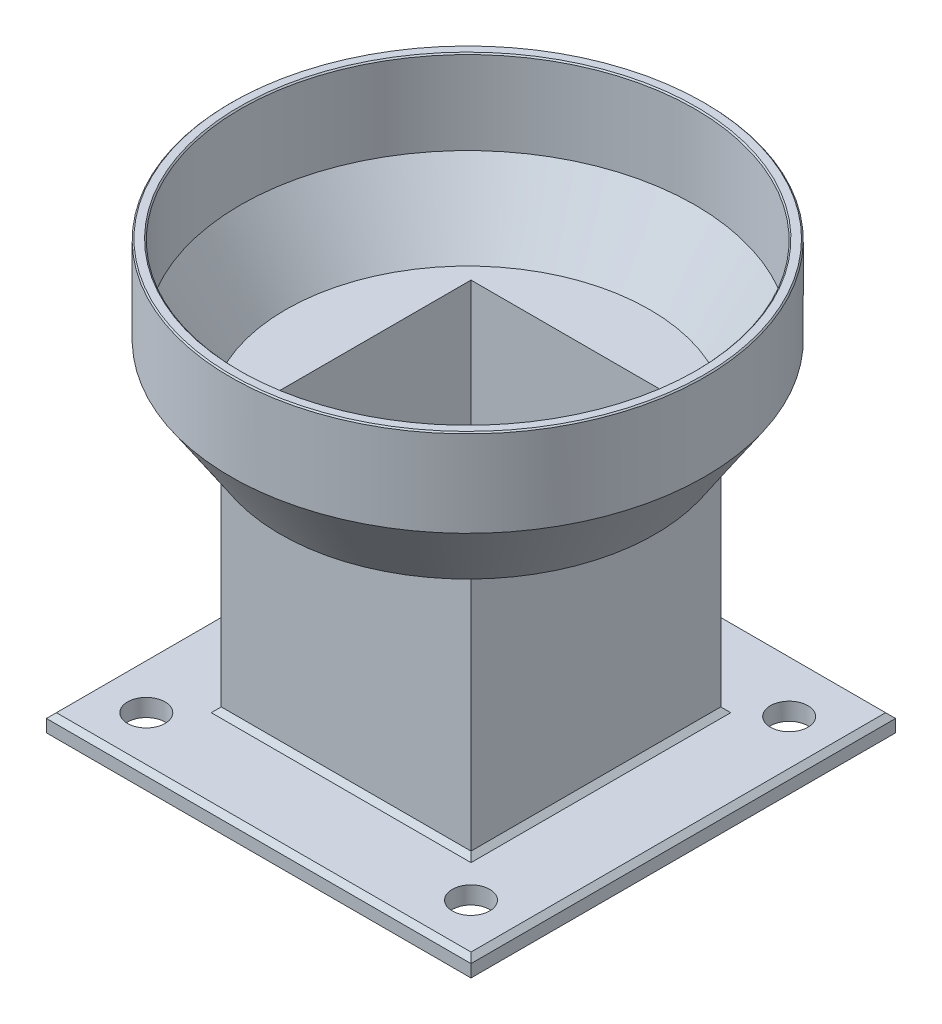
ISO-10303-21;
HEADER;
FILE_DESCRIPTION(('STEP AP214'),'2;1');
FILE_NAME('part.step','',(''),(''),'','','');
FILE_SCHEMA(('AUTOMOTIVE_DESIGN { 1 0 10303 214 1 1 1 1 }'));
ENDSEC;
DATA;
#1=APPLICATION_CONTEXT('core data for automotive mechanical design processes');
#2=APPLICATION_PROTOCOL_DEFINITION('international standard','automotive_design',2000,#1);
#3=PRODUCT_CONTEXT('',#1,'mechanical');
#4=PRODUCT('Part','Part','',(#3));
#5=PRODUCT_RELATED_PRODUCT_CATEGORY('part','',(#4));
#6=PRODUCT_DEFINITION_FORMATION('','',#4);
#7=PRODUCT_DEFINITION_CONTEXT('part definition',#1,'design');
#8=PRODUCT_DEFINITION('design','',#6,#7);
#9=PRODUCT_DEFINITION_SHAPE('','',#8);
#10=(LENGTH_UNIT() NAMED_UNIT(*) SI_UNIT(.MILLI.,.METRE.));
#11=(NAMED_UNIT(*) PLANE_ANGLE_UNIT() SI_UNIT($,.RADIAN.));
#12=(NAMED_UNIT(*) SI_UNIT($,.STERADIAN.) SOLID_ANGLE_UNIT());
#13=UNCERTAINTY_MEASURE_WITH_UNIT(LENGTH_MEASURE(1.E-05),#10,'distance_accuracy_value','');
#14=(GEOMETRIC_REPRESENTATION_CONTEXT(3) GLOBAL_UNCERTAINTY_ASSIGNED_CONTEXT((#13)) GLOBAL_UNIT_ASSIGNED_CONTEXT((#10,
#11,#12)) REPRESENTATION_CONTEXT('',''));
#15=CARTESIAN_POINT('',(0.,0.,0.));
#16=DIRECTION('',(0.,0.,1.));
#17=DIRECTION('',(1.,0.,0.));
#18=AXIS2_PLACEMENT_3D('',#15,#16,#17);
#19=CARTESIAN_POINT('',(-124.850746268657,7.,-26.3059701492537));
#20=DIRECTION('',(1.,0.,0.));
#21=DIRECTION('',(0.,0.,-1.));
#22=AXIS2_PLACEMENT_3D('',#19,#20,#21);
#23=PLANE('',#22);
#24=DIRECTION('',(0.,-1.,0.));
#25=VECTOR('',#24,1.);
#26=CARTESIAN_POINT('',(-124.850746268657,7.,143.694029850746));
#27=LINE('',#26,#25);
#28=CARTESIAN_POINT('',(-124.850746268657,5.,143.694029850746));
#29=VERTEX_POINT('',#28);
#30=CARTESIAN_POINT('',(-124.850746268657,0.,143.694029850746));
#31=VERTEX_POINT('',#30);
#32=EDGE_CURVE('E278',#29,#31,#27,.T.);
#33=ORIENTED_EDGE('',*,*,#32,.F.);
#34=DIRECTION('',(0.,0.,-1.));
#35=VECTOR('',#34,1.);
#36=CARTESIAN_POINT('',(-124.850746268657,5.,-26.3059701492537));
#37=LINE('',#36,#35);
#38=CARTESIAN_POINT('',(-124.850746268657,5.,-26.3059701492537));
#39=VERTEX_POINT('',#38);
#40=EDGE_CURVE('E317',#29,#39,#37,.T.);
#41=ORIENTED_EDGE('',*,*,#40,.T.);
#42=DIRECTION('',(0.,-1.,0.));
#43=VECTOR('',#42,1.);
#44=CARTESIAN_POINT('',(-124.850746268657,7.,-26.3059701492537));
#45=LINE('',#44,#43);
#46=CARTESIAN_POINT('',(-124.850746268657,0.,-26.3059701492537));
#47=VERTEX_POINT('',#46);
#48=EDGE_CURVE('E269',#39,#47,#45,.T.);
#49=ORIENTED_EDGE('',*,*,#48,.T.);
#50=DIRECTION('',(0.,0.,1.));
#51=VECTOR('',#50,1.);
#52=CARTESIAN_POINT('',(-124.850746268657,0.,-26.3059701492537));
#53=LINE('',#52,#51);
#54=EDGE_CURVE('E253',#47,#31,#53,.T.);
#55=ORIENTED_EDGE('',*,*,#54,.T.);
#56=EDGE_LOOP('',(#33,#41,#49,#55));
#57=FACE_BOUND('',#56,.T.);
#58=ADVANCED_FACE('F43',(#57),#23,.F.);
#59=CARTESIAN_POINT('',(-124.850746268657,7.,143.694029850746));
#60=DIRECTION('',(0.,0.,-1.));
#61=DIRECTION('',(-1.,0.,0.));
#62=AXIS2_PLACEMENT_3D('',#59,#60,#61);
#63=PLANE('',#62);
#64=DIRECTION('',(0.,-1.,0.));
#65=VECTOR('',#64,1.);
#66=CARTESIAN_POINT('',(45.1492537313433,7.,143.694029850746));
#67=LINE('',#66,#65);
#68=CARTESIAN_POINT('',(45.1492537313433,5.,143.694029850746));
#69=VERTEX_POINT('',#68);
#70=CARTESIAN_POINT('',(45.1492537313433,0.,143.694029850746));
#71=VERTEX_POINT('',#70);
#72=EDGE_CURVE('E275',#69,#71,#67,.T.);
#73=ORIENTED_EDGE('',*,*,#72,.F.);
#74=DIRECTION('',(-1.,0.,0.));
#75=VECTOR('',#74,1.);
#76=CARTESIAN_POINT('',(-124.850746268657,5.,143.694029850746));
#77=LINE('',#76,#75);
#78=EDGE_CURVE('E314',#69,#29,#77,.T.);
#79=ORIENTED_EDGE('',*,*,#78,.T.);
#80=ORIENTED_EDGE('',*,*,#32,.T.);
#81=DIRECTION('',(1.,0.,0.));
#82=VECTOR('',#81,1.);
#83=CARTESIAN_POINT('',(-124.850746268657,0.,143.694029850746));
#84=LINE('',#83,#82);
#85=EDGE_CURVE('E257',#31,#71,#84,.T.);
#86=ORIENTED_EDGE('',*,*,#85,.T.);
#87=EDGE_LOOP('',(#73,#79,#80,#86));
#88=FACE_BOUND('',#87,.T.);
#89=ADVANCED_FACE('F402',(#88),#63,.F.);
#90=CARTESIAN_POINT('',(45.1492537313433,7.,-26.3059701492537));
#91=DIRECTION('',(-1.,0.,0.));
#92=DIRECTION('',(0.,0.,1.));
#93=AXIS2_PLACEMENT_3D('',#90,#91,#92);
#94=PLANE('',#93);
#95=DIRECTION('',(0.,-1.,0.));
#96=VECTOR('',#95,1.);
#97=CARTESIAN_POINT('',(45.1492537313433,7.,-26.3059701492537));
#98=LINE('',#97,#96);
#99=CARTESIAN_POINT('',(45.1492537313433,5.,-26.3059701492537));
#100=VERTEX_POINT('',#99);
#101=CARTESIAN_POINT('',(45.1492537313433,0.,-26.3059701492537));
#102=VERTEX_POINT('',#101);
#103=EDGE_CURVE('E272',#100,#102,#98,.T.);
#104=ORIENTED_EDGE('',*,*,#103,.F.);
#105=DIRECTION('',(0.,0.,1.));
#106=VECTOR('',#105,1.);
#107=CARTESIAN_POINT('',(45.1492537313433,5.,143.694029850746));
#108=LINE('',#107,#106);
#109=EDGE_CURVE('E311',#100,#69,#108,.T.);
#110=ORIENTED_EDGE('',*,*,#109,.T.);
#111=ORIENTED_EDGE('',*,*,#72,.T.);
#112=DIRECTION('',(0.,0.,-1.));
#113=VECTOR('',#112,1.);
#114=CARTESIAN_POINT('',(45.1492537313433,0.,-26.3059701492537));
#115=LINE('',#114,#113);
#116=EDGE_CURVE('E261',#71,#102,#115,.T.);
#117=ORIENTED_EDGE('',*,*,#116,.T.);
#118=EDGE_LOOP('',(#104,#110,#111,#117));
#119=FACE_BOUND('',#118,.T.);
#120=ADVANCED_FACE('F408',(#119),#94,.F.);
#121=CARTESIAN_POINT('',(-124.850746268657,7.,-26.3059701492537));
#122=DIRECTION('',(0.,0.,1.));
#123=DIRECTION('',(1.,0.,0.));
#124=AXIS2_PLACEMENT_3D('',#121,#122,#123);
#125=PLANE('',#124);
#126=ORIENTED_EDGE('',*,*,#48,.F.);
#127=DIRECTION('',(1.,0.,0.));
#128=VECTOR('',#127,1.);
#129=CARTESIAN_POINT('',(45.1492537313433,5.,-26.3059701492537));
#130=LINE('',#129,#128);
#131=EDGE_CURVE('E307',#39,#100,#130,.T.);
#132=ORIENTED_EDGE('',*,*,#131,.T.);
#133=ORIENTED_EDGE('',*,*,#103,.T.);
#134=DIRECTION('',(-1.,0.,0.));
#135=VECTOR('',#134,1.);
#136=CARTESIAN_POINT('',(-124.850746268657,0.,-26.3059701492537));
#137=LINE('',#136,#135);
#138=EDGE_CURVE('E265',#102,#47,#137,.T.);
#139=ORIENTED_EDGE('',*,*,#138,.T.);
#140=EDGE_LOOP('',(#126,#132,#133,#139));
#141=FACE_BOUND('',#140,.T.);
#142=ADVANCED_FACE('F543',(#141),#125,.F.);
#143=CARTESIAN_POINT('',(0.,7.,0.));
#144=DIRECTION('',(0.,1.,0.));
#145=DIRECTION('',(0.,0.,1.));
#146=AXIS2_PLACEMENT_3D('',#143,#144,#145);
#147=PLANE('',#146);
#148=CARTESIAN_POINT('',(25.1492537313433,7.,-3.69402985074634));
#149=DIRECTION('',(0.,1.,0.));
#150=DIRECTION('',(0.,0.,-1.));
#151=AXIS2_PLACEMENT_3D('',#148,#149,#150);
#152=CIRCLE('',#151,7.49999999999999);
#153=CARTESIAN_POINT('',(25.1492537313433,7.,-11.1940298507463));
#154=VERTEX_POINT('',#153);
#155=EDGE_CURVE('E812',#154,#154,#152,.T.);
#156=ORIENTED_EDGE('',*,*,#155,.F.);
#157=EDGE_LOOP('',(#156));
#158=FACE_BOUND('',#157,.T.);
#159=CARTESIAN_POINT('',(-104.850746268657,7.,123.694029850746));
#160=DIRECTION('',(0.,1.,0.));
#161=DIRECTION('',(0.,0.,1.));
#162=AXIS2_PLACEMENT_3D('',#159,#160,#161);
#163=CIRCLE('',#162,7.50000000000003);
#164=CARTESIAN_POINT('',(-104.850746268657,7.,131.194029850746));
#165=VERTEX_POINT('',#164);
#166=EDGE_CURVE('E808',#165,#165,#163,.T.);
#167=ORIENTED_EDGE('',*,*,#166,.F.);
#168=EDGE_LOOP('',(#167));
#169=FACE_BOUND('',#168,.T.);
#170=CARTESIAN_POINT('',(-104.850746268657,7.,-3.69402985074634));
#171=DIRECTION('',(0.,1.,0.));
#172=DIRECTION('',(0.,0.,-1.));
#173=AXIS2_PLACEMENT_3D('',#170,#171,#172);
#174=CIRCLE('',#173,7.50000000000003);
#175=CARTESIAN_POINT('',(-104.850746268657,7.,-11.1940298507464));
#176=VERTEX_POINT('',#175);
#177=EDGE_CURVE('E800',#176,#176,#174,.T.);
#178=ORIENTED_EDGE('',*,*,#177,.F.);
#179=EDGE_LOOP('',(#178));
#180=FACE_BOUND('',#179,.T.);
#181=CARTESIAN_POINT('',(25.1492537313433,7.,123.694029850746));
#182=DIRECTION('',(0.,1.,0.));
#183=DIRECTION('',(0.,0.,1.));
#184=AXIS2_PLACEMENT_3D('',#181,#182,#183);
#185=CIRCLE('',#184,7.49999999999999);
#186=CARTESIAN_POINT('',(25.1492537313433,7.,131.194029850746));
#187=VERTEX_POINT('',#186);
#188=EDGE_CURVE('E374',#187,#187,#185,.T.);
#189=ORIENTED_EDGE('',*,*,#188,.F.);
#190=EDGE_LOOP('',(#189));
#191=FACE_BOUND('',#190,.T.);
#192=DIRECTION('',(0.,0.,-1.));
#193=VECTOR('',#192,1.);
#194=CARTESIAN_POINT('',(43.1492537313433,7.,-26.3059701492537));
#195=LINE('',#194,#193);
#196=CARTESIAN_POINT('',(43.1492537313433,7.,141.694029850746));
#197=VERTEX_POINT('',#196);
#198=CARTESIAN_POINT('',(43.1492537313433,7.,-24.3059701492537));
#199=VERTEX_POINT('',#198);
#200=EDGE_CURVE('E300',#197,#199,#195,.T.);
#201=ORIENTED_EDGE('',*,*,#200,.T.);
#202=DIRECTION('',(-1.,0.,0.));
#203=VECTOR('',#202,1.);
#204=CARTESIAN_POINT('',(-124.850746268657,7.,-24.3059701492537));
#205=LINE('',#204,#203);
#206=CARTESIAN_POINT('',(-122.850746268657,7.,-24.3059701492537));
#207=VERTEX_POINT('',#206);
#208=EDGE_CURVE('E303',#199,#207,#205,.T.);
#209=ORIENTED_EDGE('',*,*,#208,.T.);
#210=DIRECTION('',(0.,0.,1.));
#211=VECTOR('',#210,1.);
#212=CARTESIAN_POINT('',(-122.850746268657,7.,143.694029850746));
#213=LINE('',#212,#211);
#214=CARTESIAN_POINT('',(-122.850746268657,7.,141.694029850746));
#215=VERTEX_POINT('',#214);
#216=EDGE_CURVE('E294',#207,#215,#213,.T.);
#217=ORIENTED_EDGE('',*,*,#216,.T.);
#218=DIRECTION('',(1.,0.,0.));
#219=VECTOR('',#218,1.);
#220=CARTESIAN_POINT('',(45.1492537313433,7.,141.694029850746));
#221=LINE('',#220,#219);
#222=EDGE_CURVE('E297',#215,#197,#221,.T.);
#223=ORIENTED_EDGE('',*,*,#222,.T.);
#224=EDGE_LOOP('',(#201,#209,#217,#223));
#225=FACE_BOUND('',#224,.T.);
#226=DIRECTION('',(0.,0.,1.));
#227=VECTOR('',#226,1.);
#228=CARTESIAN_POINT('',(12.1492537313433,7.,0.));
#229=LINE('',#228,#227);
#230=CARTESIAN_POINT('',(12.1492537313433,7.,6.69402985074626));
#231=VERTEX_POINT('',#230);
#232=CARTESIAN_POINT('',(12.1492537313433,7.,110.694029850746));
#233=VERTEX_POINT('',#232);
#234=EDGE_CURVE('E287',#231,#233,#229,.T.);
#235=ORIENTED_EDGE('',*,*,#234,.T.);
#236=DIRECTION('',(-1.,0.,0.));
#237=VECTOR('',#236,1.);
#238=CARTESIAN_POINT('',(0.,7.,110.694029850746));
#239=LINE('',#238,#237);
#240=CARTESIAN_POINT('',(-91.8507462686567,7.,110.694029850746));
#241=VERTEX_POINT('',#240);
#242=EDGE_CURVE('E290',#233,#241,#239,.T.);
#243=ORIENTED_EDGE('',*,*,#242,.T.);
#244=DIRECTION('',(0.,0.,-1.));
#245=VECTOR('',#244,1.);
#246=CARTESIAN_POINT('',(-91.8507462686567,7.,0.));
#247=LINE('',#246,#245);
#248=CARTESIAN_POINT('',(-91.8507462686567,7.,6.69402985074626));
#249=VERTEX_POINT('',#248);
#250=EDGE_CURVE('E281',#241,#249,#247,.T.);
#251=ORIENTED_EDGE('',*,*,#250,.T.);
#252=DIRECTION('',(1.,0.,0.));
#253=VECTOR('',#252,1.);
#254=CARTESIAN_POINT('',(0.,7.,6.69402985074626));
#255=LINE('',#254,#253);
#256=EDGE_CURVE('E284',#249,#231,#255,.T.);
#257=ORIENTED_EDGE('',*,*,#256,.T.);
#258=EDGE_LOOP('',(#235,#243,#251,#257));
#259=FACE_BOUND('',#258,.T.);
#260=ADVANCED_FACE('F540',(#158,#169,#180,#191,#225,#259),#147,.T.);
#261=CARTESIAN_POINT('',(0.,0.,0.));
#262=DIRECTION('',(0.,1.,0.));
#263=DIRECTION('',(0.,0.,1.));
#264=AXIS2_PLACEMENT_3D('',#261,#262,#263);
#265=PLANE('',#264);
#266=CARTESIAN_POINT('',(25.1492537313433,0.,-3.69402985074634));
#267=DIRECTION('',(0.,1.,0.));
#268=DIRECTION('',(0.,0.,1.));
#269=AXIS2_PLACEMENT_3D('',#266,#267,#268);
#270=CIRCLE('',#269,7.49999999999999);
#271=CARTESIAN_POINT('',(25.1492537313433,0.,3.80597014925366));
#272=VERTEX_POINT('',#271);
#273=EDGE_CURVE('E48',#272,#272,#270,.T.);
#274=ORIENTED_EDGE('',*,*,#273,.T.);
#275=EDGE_LOOP('',(#274));
#276=FACE_BOUND('',#275,.T.);
#277=CARTESIAN_POINT('',(-104.850746268657,0.,123.694029850746));
#278=DIRECTION('',(0.,1.,0.));
#279=DIRECTION('',(0.,0.,1.));
#280=AXIS2_PLACEMENT_3D('',#277,#278,#279);
#281=CIRCLE('',#280,7.50000000000003);
#282=CARTESIAN_POINT('',(-104.850746268657,0.,131.194029850746));
#283=VERTEX_POINT('',#282);
#284=EDGE_CURVE('E377',#283,#283,#281,.T.);
#285=ORIENTED_EDGE('',*,*,#284,.T.);
#286=EDGE_LOOP('',(#285));
#287=FACE_BOUND('',#286,.T.);
#288=CARTESIAN_POINT('',(-104.850746268657,0.,-3.69402985074634));
#289=DIRECTION('',(0.,1.,0.));
#290=DIRECTION('',(0.,0.,1.));
#291=AXIS2_PLACEMENT_3D('',#288,#289,#290);
#292=CIRCLE('',#291,7.50000000000003);
#293=CARTESIAN_POINT('',(-104.850746268657,0.,3.80597014925369));
#294=VERTEX_POINT('',#293);
#295=EDGE_CURVE('E373',#294,#294,#292,.T.);
#296=ORIENTED_EDGE('',*,*,#295,.T.);
#297=EDGE_LOOP('',(#296));
#298=FACE_BOUND('',#297,.T.);
#299=CARTESIAN_POINT('',(25.1492537313433,0.,123.694029850746));
#300=DIRECTION('',(0.,1.,0.));
#301=DIRECTION('',(0.,0.,1.));
#302=AXIS2_PLACEMENT_3D('',#299,#300,#301);
#303=CIRCLE('',#302,7.49999999999999);
#304=CARTESIAN_POINT('',(25.1492537313433,0.,131.194029850746));
#305=VERTEX_POINT('',#304);
#306=EDGE_CURVE('E369',#305,#305,#303,.T.);
#307=ORIENTED_EDGE('',*,*,#306,.T.);
#308=EDGE_LOOP('',(#307));
#309=FACE_BOUND('',#308,.T.);
#310=ORIENTED_EDGE('',*,*,#54,.F.);
#311=ORIENTED_EDGE('',*,*,#138,.F.);
#312=ORIENTED_EDGE('',*,*,#116,.F.);
#313=ORIENTED_EDGE('',*,*,#85,.F.);
#314=EDGE_LOOP('',(#310,#311,#312,#313));
#315=FACE_BOUND('',#314,.T.);
#316=ADVANCED_FACE('F386',(#276,#287,#298,#309,#315),#265,.F.);
#317=CARTESIAN_POINT('',(-89.8507462686567,107.,8.69402985074628));
#318=DIRECTION('',(1.,0.,0.));
#319=DIRECTION('',(0.,0.,-1.));
#320=AXIS2_PLACEMENT_3D('',#317,#318,#319);
#321=PLANE('',#320);
#322=DIRECTION('',(0.,-1.,0.));
#323=VECTOR('',#322,1.);
#324=CARTESIAN_POINT('',(-89.8507462686567,107.,8.69402985074628));
#325=LINE('',#324,#323);
#326=CARTESIAN_POINT('',(-89.8507462686567,107.,8.69402985074628));
#327=VERTEX_POINT('',#326);
#328=CARTESIAN_POINT('',(-89.8507462686567,9.00000000000008,8.69402985074628));
#329=VERTEX_POINT('',#328);
#330=EDGE_CURVE('E240',#327,#329,#325,.T.);
#331=ORIENTED_EDGE('',*,*,#330,.T.);
#332=DIRECTION('',(0.,0.,1.));
#333=VECTOR('',#332,1.);
#334=CARTESIAN_POINT('',(-89.8507462686567,9.00000000000005,8.69402985074628));
#335=LINE('',#334,#333);
#336=CARTESIAN_POINT('',(-89.8507462686567,9.00000000000008,108.694029850746));
#337=VERTEX_POINT('',#336);
#338=EDGE_CURVE('E328',#329,#337,#335,.T.);
#339=ORIENTED_EDGE('',*,*,#338,.T.);
#340=DIRECTION('',(0.,-1.,0.));
#341=VECTOR('',#340,1.);
#342=CARTESIAN_POINT('',(-89.8507462686567,107.,108.694029850746));
#343=LINE('',#342,#341);
#344=CARTESIAN_POINT('',(-89.8507462686567,107.,108.694029850746));
#345=VERTEX_POINT('',#344);
#346=EDGE_CURVE('E249',#345,#337,#343,.T.);
#347=ORIENTED_EDGE('',*,*,#346,.F.);
#348=DIRECTION('',(0.,0.,1.));
#349=VECTOR('',#348,1.);
#350=CARTESIAN_POINT('',(-89.8507462686567,107.,8.69402985074628));
#351=LINE('',#350,#349);
#352=EDGE_CURVE('E224',#327,#345,#351,.T.);
#353=ORIENTED_EDGE('',*,*,#352,.F.);
#354=EDGE_LOOP('',(#331,#339,#347,#353));
#355=FACE_BOUND('',#354,.T.);
#356=ADVANCED_FACE('F535',(#355),#321,.F.);
#357=CARTESIAN_POINT('',(-89.8507462686567,107.,108.694029850746));
#358=DIRECTION('',(0.,0.,-1.));
#359=DIRECTION('',(-1.,0.,0.));
#360=AXIS2_PLACEMENT_3D('',#357,#358,#359);
#361=PLANE('',#360);
#362=ORIENTED_EDGE('',*,*,#346,.T.);
#363=DIRECTION('',(1.,0.,0.));
#364=VECTOR('',#363,1.);
#365=CARTESIAN_POINT('',(-89.8507462686567,9.00000000000005,108.694029850746));
#366=LINE('',#365,#364);
#367=CARTESIAN_POINT('',(10.1492537313433,9.00000000000008,108.694029850746));
#368=VERTEX_POINT('',#367);
#369=EDGE_CURVE('E320',#337,#368,#366,.T.);
#370=ORIENTED_EDGE('',*,*,#369,.T.);
#371=DIRECTION('',(0.,-1.,0.));
#372=VECTOR('',#371,1.);
#373=CARTESIAN_POINT('',(10.1492537313433,107.,108.694029850746));
#374=LINE('',#373,#372);
#375=CARTESIAN_POINT('',(10.1492537313433,107.,108.694029850746));
#376=VERTEX_POINT('',#375);
#377=EDGE_CURVE('E246',#376,#368,#374,.T.);
#378=ORIENTED_EDGE('',*,*,#377,.F.);
#379=DIRECTION('',(1.,0.,0.));
#380=VECTOR('',#379,1.);
#381=CARTESIAN_POINT('',(-89.8507462686567,107.,108.694029850746));
#382=LINE('',#381,#380);
#383=EDGE_CURVE('E228',#345,#376,#382,.T.);
#384=ORIENTED_EDGE('',*,*,#383,.F.);
#385=EDGE_LOOP('',(#362,#370,#378,#384));
#386=FACE_BOUND('',#385,.T.);
#387=ADVANCED_FACE('F532',(#386),#361,.F.);
#388=CARTESIAN_POINT('',(10.1492537313433,107.,8.69402985074628));
#389=DIRECTION('',(-1.,0.,0.));
#390=DIRECTION('',(0.,0.,1.));
#391=AXIS2_PLACEMENT_3D('',#388,#389,#390);
#392=PLANE('',#391);
#393=ORIENTED_EDGE('',*,*,#377,.T.);
#394=DIRECTION('',(0.,0.,-1.));
#395=VECTOR('',#394,1.);
#396=CARTESIAN_POINT('',(10.1492537313433,9.00000000000005,8.69402985074628));
#397=LINE('',#396,#395);
#398=CARTESIAN_POINT('',(10.1492537313433,9.00000000000008,8.69402985074628));
#399=VERTEX_POINT('',#398);
#400=EDGE_CURVE('E70',#368,#399,#397,.T.);
#401=ORIENTED_EDGE('',*,*,#400,.T.);
#402=DIRECTION('',(0.,-1.,0.));
#403=VECTOR('',#402,1.);
#404=CARTESIAN_POINT('',(10.1492537313433,107.,8.69402985074628));
#405=LINE('',#404,#403);
#406=CARTESIAN_POINT('',(10.1492537313433,107.,8.69402985074628));
#407=VERTEX_POINT('',#406);
#408=EDGE_CURVE('E243',#407,#399,#405,.T.);
#409=ORIENTED_EDGE('',*,*,#408,.F.);
#410=DIRECTION('',(0.,0.,-1.));
#411=VECTOR('',#410,1.);
#412=CARTESIAN_POINT('',(10.1492537313433,107.,8.69402985074628));
#413=LINE('',#412,#411);
#414=EDGE_CURVE('E232',#376,#407,#413,.T.);
#415=ORIENTED_EDGE('',*,*,#414,.F.);
#416=EDGE_LOOP('',(#393,#401,#409,#415));
#417=FACE_BOUND('',#416,.T.);
#418=ADVANCED_FACE('F529',(#417),#392,.F.);
#419=CARTESIAN_POINT('',(-89.8507462686567,107.,8.69402985074628));
#420=DIRECTION('',(0.,0.,1.));
#421=DIRECTION('',(1.,0.,0.));
#422=AXIS2_PLACEMENT_3D('',#419,#420,#421);
#423=PLANE('',#422);
#424=ORIENTED_EDGE('',*,*,#408,.T.);
#425=DIRECTION('',(-1.,0.,0.));
#426=VECTOR('',#425,1.);
#427=CARTESIAN_POINT('',(-89.8507462686567,9.00000000000005,8.69402985074628));
#428=LINE('',#427,#426);
#429=EDGE_CURVE('E62',#399,#329,#428,.T.);
#430=ORIENTED_EDGE('',*,*,#429,.T.);
#431=ORIENTED_EDGE('',*,*,#330,.F.);
#432=DIRECTION('',(-1.,0.,0.));
#433=VECTOR('',#432,1.);
#434=CARTESIAN_POINT('',(-89.8507462686567,107.,8.69402985074628));
#435=LINE('',#434,#433);
#436=EDGE_CURVE('E236',#407,#327,#435,.T.);
#437=ORIENTED_EDGE('',*,*,#436,.F.);
#438=EDGE_LOOP('',(#424,#430,#431,#437));
#439=FACE_BOUND('',#438,.T.);
#440=ADVANCED_FACE('F518',(#439),#423,.F.);
#441=CARTESIAN_POINT('',(-39.8507462686567,107.,60.));
#442=DIRECTION('',(0.,1.,0.));
#443=DIRECTION('',(-1.,0.,0.));
#444=AXIS2_PLACEMENT_3D('',#441,#442,#443);
#445=PLANE('',#444);
#446=CARTESIAN_POINT('',(-39.8507462686567,107.,60.));
#447=DIRECTION('',(0.,1.,0.));
#448=DIRECTION('',(-1.,0.,0.));
#449=AXIS2_PLACEMENT_3D('',#446,#447,#448);
#450=CIRCLE('',#449,75.);
#451=CARTESIAN_POINT('',(-114.850746268657,107.,60.));
#452=VERTEX_POINT('',#451);
#453=EDGE_CURVE('E216',#452,#452,#450,.T.);
#454=ORIENTED_EDGE('',*,*,#453,.F.);
#455=EDGE_LOOP('',(#454));
#456=FACE_BOUND('',#455,.T.);
#457=ORIENTED_EDGE('',*,*,#436,.T.);
#458=ORIENTED_EDGE('',*,*,#352,.T.);
#459=ORIENTED_EDGE('',*,*,#383,.T.);
#460=ORIENTED_EDGE('',*,*,#414,.T.);
#461=EDGE_LOOP('',(#457,#458,#459,#460));
#462=FACE_BOUND('',#461,.T.);
#463=ADVANCED_FACE('F515',(#456,#462),#445,.F.);
#464=CARTESIAN_POINT('',(-39.8507462686567,107.,60.));
#465=DIRECTION('',(0.,1.,0.));
#466=DIRECTION('',(-1.,0.,0.));
#467=AXIS2_PLACEMENT_3D('',#464,#465,#466);
#468=CONICAL_SURFACE('',#467,75.,0.588002603547568);
#469=CARTESIAN_POINT('',(-39.8507462686567,137.,60.));
#470=DIRECTION('',(0.,1.,0.));
#471=DIRECTION('',(-1.,0.,0.));
#472=AXIS2_PLACEMENT_3D('',#469,#470,#471);
#473=CIRCLE('',#472,95.);
#474=CARTESIAN_POINT('',(-134.850746268657,137.,60.));
#475=VERTEX_POINT('',#474);
#476=EDGE_CURVE('E220',#475,#475,#473,.T.);
#477=ORIENTED_EDGE('',*,*,#476,.F.);
#478=EDGE_LOOP('',(#477));
#479=FACE_BOUND('',#478,.T.);
#480=ORIENTED_EDGE('',*,*,#453,.T.);
#481=EDGE_LOOP('',(#480));
#482=FACE_BOUND('',#481,.T.);
#483=ADVANCED_FACE('F517',(#479,#482),#468,.T.);
#484=CARTESIAN_POINT('',(-39.8507462686567,172.,60.));
#485=DIRECTION('',(0.,1.,0.));
#486=DIRECTION('',(-1.,0.,0.));
#487=AXIS2_PLACEMENT_3D('',#484,#485,#486);
#488=CYLINDRICAL_SURFACE('',#487,95.);
#489=CARTESIAN_POINT('',(-39.8507462686567,171.5,60.));
#490=DIRECTION('',(0.,-1.,0.));
#491=DIRECTION('',(0.,0.,-1.));
#492=AXIS2_PLACEMENT_3D('',#489,#490,#491);
#493=CIRCLE('',#492,95.);
#494=CARTESIAN_POINT('',(-39.8507462686567,171.5,-35.));
#495=VERTEX_POINT('',#494);
#496=EDGE_CURVE('E54',#495,#495,#493,.T.);
#497=ORIENTED_EDGE('',*,*,#496,.T.);
#498=EDGE_LOOP('',(#497));
#499=FACE_BOUND('',#498,.T.);
#500=ORIENTED_EDGE('',*,*,#476,.T.);
#501=EDGE_LOOP('',(#500));
#502=FACE_BOUND('',#501,.T.);
#503=ADVANCED_FACE('F489',(#499,#502),#488,.T.);
#504=CARTESIAN_POINT('',(55.1492537313433,172.,60.));
#505=DIRECTION('',(0.,-1.,0.));
#506=DIRECTION('',(1.,0.,0.));
#507=AXIS2_PLACEMENT_3D('',#504,#505,#506);
#508=PLANE('',#507);
#509=CARTESIAN_POINT('',(-39.8507462686567,172.,60.));
#510=DIRECTION('',(0.,-1.,0.));
#511=DIRECTION('',(1.,0.,0.));
#512=AXIS2_PLACEMENT_3D('',#509,#510,#511);
#513=CIRCLE('',#512,94.5);
#514=CARTESIAN_POINT('',(54.6492537313433,172.,60.));
#515=VERTEX_POINT('',#514);
#516=EDGE_CURVE('E362',#515,#515,#513,.F.);
#517=ORIENTED_EDGE('',*,*,#516,.T.);
#518=EDGE_LOOP('',(#517));
#519=FACE_BOUND('',#518,.T.);
#520=CARTESIAN_POINT('',(-39.8507462686567,172.,60.));
#521=DIRECTION('',(0.,-1.,0.));
#522=DIRECTION('',(1.,0.,0.));
#523=AXIS2_PLACEMENT_3D('',#520,#521,#522);
#524=CIRCLE('',#523,91.4999999999999);
#525=CARTESIAN_POINT('',(51.6492537313432,172.,60.));
#526=VERTEX_POINT('',#525);
#527=EDGE_CURVE('E331',#526,#526,#524,.T.);
#528=ORIENTED_EDGE('',*,*,#527,.T.);
#529=EDGE_LOOP('',(#528));
#530=FACE_BOUND('',#529,.T.);
#531=ADVANCED_FACE('F485',(#519,#530),#508,.F.);
#532=CARTESIAN_POINT('',(0.,4.,0.));
#533=DIRECTION('',(0.,1.,0.));
#534=DIRECTION('',(0.,0.,1.));
#535=AXIS2_PLACEMENT_3D('',#532,#533,#534);
#536=PLANE('',#535);
#537=DIRECTION('',(0.,0.,1.));
#538=VECTOR('',#537,1.);
#539=CARTESIAN_POINT('',(6.14925373134329,4.,0.));
#540=LINE('',#539,#538);
#541=CARTESIAN_POINT('',(6.14925373134329,4.,12.6940298507463));
#542=VERTEX_POINT('',#541);
#543=CARTESIAN_POINT('',(6.1492537313433,4.,104.694029850746));
#544=VERTEX_POINT('',#543);
#545=EDGE_CURVE('E209',#542,#544,#540,.T.);
#546=ORIENTED_EDGE('',*,*,#545,.F.);
#547=DIRECTION('',(1.,0.,0.));
#548=VECTOR('',#547,1.);
#549=CARTESIAN_POINT('',(0.,4.,12.6940298507463));
#550=LINE('',#549,#548);
#551=CARTESIAN_POINT('',(-85.8507462686567,4.,12.6940298507463));
#552=VERTEX_POINT('',#551);
#553=EDGE_CURVE('E205',#552,#542,#550,.T.);
#554=ORIENTED_EDGE('',*,*,#553,.F.);
#555=DIRECTION('',(0.,0.,-1.));
#556=VECTOR('',#555,1.);
#557=CARTESIAN_POINT('',(-85.8507462686567,4.,0.));
#558=LINE('',#557,#556);
#559=CARTESIAN_POINT('',(-85.8507462686567,4.,104.694029850746));
#560=VERTEX_POINT('',#559);
#561=EDGE_CURVE('E180',#560,#552,#558,.T.);
#562=ORIENTED_EDGE('',*,*,#561,.F.);
#563=DIRECTION('',(-1.,0.,0.));
#564=VECTOR('',#563,1.);
#565=CARTESIAN_POINT('',(0.,4.,104.694029850746));
#566=LINE('',#565,#564);
#567=EDGE_CURVE('E212',#544,#560,#566,.T.);
#568=ORIENTED_EDGE('',*,*,#567,.F.);
#569=EDGE_LOOP('',(#546,#554,#562,#568));
#570=FACE_BOUND('',#569,.T.);
#571=ADVANCED_FACE('F488',(#570),#536,.T.);
#572=CARTESIAN_POINT('',(-85.8507462686567,107.,8.69402985074628));
#573=DIRECTION('',(1.,0.,0.));
#574=DIRECTION('',(0.,0.,-1.));
#575=AXIS2_PLACEMENT_3D('',#572,#573,#574);
#576=PLANE('',#575);
#577=ORIENTED_EDGE('',*,*,#561,.T.);
#578=DIRECTION('',(0.,-1.,0.));
#579=VECTOR('',#578,1.);
#580=CARTESIAN_POINT('',(-85.8507462686567,107.,12.6940298507463));
#581=LINE('',#580,#579);
#582=CARTESIAN_POINT('',(-85.8507462686567,111.,12.6940298507463));
#583=VERTEX_POINT('',#582);
#584=EDGE_CURVE('E178',#583,#552,#581,.T.);
#585=ORIENTED_EDGE('',*,*,#584,.F.);
#586=DIRECTION('',(0.,0.,1.));
#587=VECTOR('',#586,1.);
#588=CARTESIAN_POINT('',(-85.8507462686567,111.,8.69402985074628));
#589=LINE('',#588,#587);
#590=CARTESIAN_POINT('',(-85.8507462686567,111.,104.694029850746));
#591=VERTEX_POINT('',#590);
#592=EDGE_CURVE('E162',#583,#591,#589,.T.);
#593=ORIENTED_EDGE('',*,*,#592,.T.);
#594=DIRECTION('',(0.,-1.,0.));
#595=VECTOR('',#594,1.);
#596=CARTESIAN_POINT('',(-85.8507462686567,107.,104.694029850746));
#597=LINE('',#596,#595);
#598=EDGE_CURVE('E206',#591,#560,#597,.T.);
#599=ORIENTED_EDGE('',*,*,#598,.T.);
#600=EDGE_LOOP('',(#577,#585,#593,#599));
#601=FACE_BOUND('',#600,.T.);
#602=ADVANCED_FACE('F179',(#601),#576,.T.);
#603=CARTESIAN_POINT('',(-89.8507462686567,107.,104.694029850746));
#604=DIRECTION('',(0.,0.,-1.));
#605=DIRECTION('',(-1.,0.,0.));
#606=AXIS2_PLACEMENT_3D('',#603,#604,#605);
#607=PLANE('',#606);
#608=ORIENTED_EDGE('',*,*,#567,.T.);
#609=ORIENTED_EDGE('',*,*,#598,.F.);
#610=DIRECTION('',(1.,0.,0.));
#611=VECTOR('',#610,1.);
#612=CARTESIAN_POINT('',(-89.8507462686567,111.,104.694029850746));
#613=LINE('',#612,#611);
#614=CARTESIAN_POINT('',(6.1492537313433,111.,104.694029850746));
#615=VERTEX_POINT('',#614);
#616=EDGE_CURVE('E170',#591,#615,#613,.T.);
#617=ORIENTED_EDGE('',*,*,#616,.T.);
#618=DIRECTION('',(0.,-1.,0.));
#619=VECTOR('',#618,1.);
#620=CARTESIAN_POINT('',(6.1492537313433,107.,104.694029850746));
#621=LINE('',#620,#619);
#622=EDGE_CURVE('E821',#615,#544,#621,.T.);
#623=ORIENTED_EDGE('',*,*,#622,.T.);
#624=EDGE_LOOP('',(#608,#609,#617,#623));
#625=FACE_BOUND('',#624,.T.);
#626=ADVANCED_FACE('F653',(#625),#607,.T.);
#627=CARTESIAN_POINT('',(6.14925373134329,107.,8.69402985074628));
#628=DIRECTION('',(-1.,0.,0.));
#629=DIRECTION('',(0.,0.,1.));
#630=AXIS2_PLACEMENT_3D('',#627,#628,#629);
#631=PLANE('',#630);
#632=ORIENTED_EDGE('',*,*,#545,.T.);
#633=ORIENTED_EDGE('',*,*,#622,.F.);
#634=DIRECTION('',(0.,0.,-1.));
#635=VECTOR('',#634,1.);
#636=CARTESIAN_POINT('',(6.14925373134329,111.,8.69402985074628));
#637=LINE('',#636,#635);
#638=CARTESIAN_POINT('',(6.14925373134329,111.,12.6940298507463));
#639=VERTEX_POINT('',#638);
#640=EDGE_CURVE('E189',#615,#639,#637,.T.);
#641=ORIENTED_EDGE('',*,*,#640,.T.);
#642=DIRECTION('',(0.,-1.,0.));
#643=VECTOR('',#642,1.);
#644=CARTESIAN_POINT('',(6.14925373134328,107.,12.6940298507463));
#645=LINE('',#644,#643);
#646=EDGE_CURVE('E184',#639,#542,#645,.T.);
#647=ORIENTED_EDGE('',*,*,#646,.T.);
#648=EDGE_LOOP('',(#632,#633,#641,#647));
#649=FACE_BOUND('',#648,.T.);
#650=ADVANCED_FACE('F511',(#649),#631,.T.);
#651=CARTESIAN_POINT('',(-89.8507462686567,107.,12.6940298507463));
#652=DIRECTION('',(0.,0.,1.));
#653=DIRECTION('',(1.,0.,0.));
#654=AXIS2_PLACEMENT_3D('',#651,#652,#653);
#655=PLANE('',#654);
#656=ORIENTED_EDGE('',*,*,#553,.T.);
#657=ORIENTED_EDGE('',*,*,#646,.F.);
#658=DIRECTION('',(-1.,0.,0.));
#659=VECTOR('',#658,1.);
#660=CARTESIAN_POINT('',(-89.8507462686567,111.,12.6940298507463));
#661=LINE('',#660,#659);
#662=EDGE_CURVE('E167',#639,#583,#661,.T.);
#663=ORIENTED_EDGE('',*,*,#662,.T.);
#664=ORIENTED_EDGE('',*,*,#584,.T.);
#665=EDGE_LOOP('',(#656,#657,#663,#664));
#666=FACE_BOUND('',#665,.T.);
#667=ADVANCED_FACE('F186',(#666),#655,.T.);
#668=CARTESIAN_POINT('',(-39.8507462686567,111.,60.));
#669=DIRECTION('',(0.,1.,0.));
#670=DIRECTION('',(-1.,0.,0.));
#671=AXIS2_PLACEMENT_3D('',#668,#669,#670);
#672=PLANE('',#671);
#673=CARTESIAN_POINT('',(-39.8507462686567,111.,60.));
#674=DIRECTION('',(0.,1.,0.));
#675=DIRECTION('',(-1.,0.,0.));
#676=AXIS2_PLACEMENT_3D('',#673,#674,#675);
#677=CIRCLE('',#676,72.859264966048);
#678=CARTESIAN_POINT('',(-112.710011234705,111.,60.));
#679=VERTEX_POINT('',#678);
#680=EDGE_CURVE('E195',#679,#679,#677,.T.);
#681=ORIENTED_EDGE('',*,*,#680,.T.);
#682=EDGE_LOOP('',(#681));
#683=FACE_BOUND('',#682,.T.);
#684=ORIENTED_EDGE('',*,*,#662,.F.);
#685=ORIENTED_EDGE('',*,*,#640,.F.);
#686=ORIENTED_EDGE('',*,*,#616,.F.);
#687=ORIENTED_EDGE('',*,*,#592,.F.);
#688=EDGE_LOOP('',(#684,#685,#686,#687));
#689=FACE_BOUND('',#688,.T.);
#690=ADVANCED_FACE('F164',(#683,#689),#672,.T.);
#691=CARTESIAN_POINT('',(-39.8507462686567,109.218800784901,60.));
#692=DIRECTION('',(0.,1.,0.));
#693=DIRECTION('',(-1.,0.,0.));
#694=AXIS2_PLACEMENT_3D('',#691,#692,#693);
#695=CONICAL_SURFACE('',#694,71.6717988226486,0.588002603547568);
#696=CARTESIAN_POINT('',(-39.8507462686567,138.211102550928,60.));
#697=DIRECTION('',(0.,1.,0.));
#698=DIRECTION('',(-1.,0.,0.));
#699=AXIS2_PLACEMENT_3D('',#696,#697,#698);
#700=CIRCLE('',#699,91.);
#701=CARTESIAN_POINT('',(-130.850746268657,138.211102550928,60.));
#702=VERTEX_POINT('',#701);
#703=EDGE_CURVE('E175',#702,#702,#700,.T.);
#704=ORIENTED_EDGE('',*,*,#703,.T.);
#705=EDGE_LOOP('',(#704));
#706=FACE_BOUND('',#705,.T.);
#707=ORIENTED_EDGE('',*,*,#680,.F.);
#708=EDGE_LOOP('',(#707));
#709=FACE_BOUND('',#708,.T.);
#710=ADVANCED_FACE('F497',(#706,#709),#695,.F.);
#711=CARTESIAN_POINT('',(-39.8507462686567,172.,60.));
#712=DIRECTION('',(0.,1.,0.));
#713=DIRECTION('',(-1.,0.,0.));
#714=AXIS2_PLACEMENT_3D('',#711,#712,#713);
#715=CYLINDRICAL_SURFACE('',#714,91.);
#716=CARTESIAN_POINT('',(-39.8507462686567,171.5,60.));
#717=DIRECTION('',(0.,-1.,0.));
#718=DIRECTION('',(0.,0.,-1.));
#719=AXIS2_PLACEMENT_3D('',#716,#717,#718);
#720=CIRCLE('',#719,91.);
#721=CARTESIAN_POINT('',(-39.8507462686567,171.5,-31.));
#722=VERTEX_POINT('',#721);
#723=EDGE_CURVE('E11',#722,#722,#720,.F.);
#724=ORIENTED_EDGE('',*,*,#723,.T.);
#725=EDGE_LOOP('',(#724));
#726=FACE_BOUND('',#725,.T.);
#727=ORIENTED_EDGE('',*,*,#703,.F.);
#728=EDGE_LOOP('',(#727));
#729=FACE_BOUND('',#728,.T.);
#730=ADVANCED_FACE('F443',(#726,#729),#715,.F.);
#731=CARTESIAN_POINT('',(0.,7.,141.694029850746));
#732=DIRECTION('',(0.,0.707106781186543,0.707106781186552));
#733=DIRECTION('',(-1.,0.,0.));
#734=AXIS2_PLACEMENT_3D('',#731,#732,#733);
#735=PLANE('',#734);
#736=DIRECTION('',(0.577350269189622,0.577350269189632,-0.577350269189624));
#737=VECTOR('',#736,1.);
#738=CARTESIAN_POINT('',(-75.6194029850751,54.2313432835824,94.4626865671646));
#739=LINE('',#738,#737);
#740=EDGE_CURVE('E339',#29,#215,#739,.T.);
#741=ORIENTED_EDGE('',*,*,#740,.F.);
#742=ORIENTED_EDGE('',*,*,#78,.F.);
#743=DIRECTION('',(-0.577350269189623,0.577350269189631,-0.577350269189623));
#744=VECTOR('',#743,1.);
#745=CARTESIAN_POINT('',(28.766169154229,21.3830845771145,127.310945273632));
#746=LINE('',#745,#744);
#747=EDGE_CURVE('E199',#197,#69,#746,.F.);
#748=ORIENTED_EDGE('',*,*,#747,.F.);
#749=ORIENTED_EDGE('',*,*,#222,.F.);
#750=EDGE_LOOP('',(#741,#742,#748,#749));
#751=FACE_BOUND('',#750,.T.);
#752=ADVANCED_FACE('F437',(#751),#735,.T.);
#753=CARTESIAN_POINT('',(43.1492537313433,7.,0.));
#754=DIRECTION('',(0.707106781186553,0.707106781186542,0.));
#755=DIRECTION('',(0.,0.,1.));
#756=AXIS2_PLACEMENT_3D('',#753,#754,#755);
#757=PLANE('',#756);
#758=ORIENTED_EDGE('',*,*,#747,.T.);
#759=ORIENTED_EDGE('',*,*,#109,.F.);
#760=DIRECTION('',(-0.577350269189623,0.577350269189631,0.577350269189623));
#761=VECTOR('',#760,1.);
#762=CARTESIAN_POINT('',(35.0472636815921,15.1019900497513,-16.2039800995026));
#763=LINE('',#762,#761);
#764=EDGE_CURVE('E335',#199,#100,#763,.F.);
#765=ORIENTED_EDGE('',*,*,#764,.F.);
#766=ORIENTED_EDGE('',*,*,#200,.F.);
#767=EDGE_LOOP('',(#758,#759,#765,#766));
#768=FACE_BOUND('',#767,.T.);
#769=ADVANCED_FACE('F430',(#768),#757,.T.);
#770=CARTESIAN_POINT('',(-122.850746268657,7.,0.));
#771=DIRECTION('',(-0.707106781186553,0.707106781186542,0.));
#772=DIRECTION('',(0.,0.,-1.));
#773=AXIS2_PLACEMENT_3D('',#770,#771,#772);
#774=PLANE('',#773);
#775=ORIENTED_EDGE('',*,*,#740,.T.);
#776=ORIENTED_EDGE('',*,*,#216,.F.);
#777=DIRECTION('',(-0.577350269189622,-0.577350269189632,-0.577350269189624));
#778=VECTOR('',#777,1.);
#779=CARTESIAN_POINT('',(-114.748756218906,15.1019900497513,-16.2039800995025));
#780=LINE('',#779,#778);
#781=EDGE_CURVE('E332',#39,#207,#780,.F.);
#782=ORIENTED_EDGE('',*,*,#781,.F.);
#783=ORIENTED_EDGE('',*,*,#40,.F.);
#784=EDGE_LOOP('',(#775,#776,#782,#783));
#785=FACE_BOUND('',#784,.T.);
#786=ADVANCED_FACE('F423',(#785),#774,.T.);
#787=CARTESIAN_POINT('',(0.,7.,-24.3059701492537));
#788=DIRECTION('',(0.,0.707106781186543,-0.707106781186552));
#789=DIRECTION('',(1.,0.,0.));
#790=AXIS2_PLACEMENT_3D('',#787,#788,#789);
#791=PLANE('',#790);
#792=ORIENTED_EDGE('',*,*,#764,.T.);
#793=ORIENTED_EDGE('',*,*,#131,.F.);
#794=ORIENTED_EDGE('',*,*,#781,.T.);
#795=ORIENTED_EDGE('',*,*,#208,.F.);
#796=EDGE_LOOP('',(#792,#793,#794,#795));
#797=FACE_BOUND('',#796,.T.);
#798=ADVANCED_FACE('F415',(#797),#791,.T.);
#799=CARTESIAN_POINT('',(-89.8507462686567,9.00000000000005,8.69402985074628));
#800=DIRECTION('',(0.,-0.707106781186544,0.707106781186551));
#801=DIRECTION('',(-1.,0.,0.));
#802=AXIS2_PLACEMENT_3D('',#799,#800,#801);
#803=PLANE('',#802);
#804=DIRECTION('',(0.577350269189624,-0.57735026918963,-0.577350269189624));
#805=VECTOR('',#804,1.);
#806=CARTESIAN_POINT('',(-23.1840796019898,42.3333333333335,42.0273631840794));
#807=LINE('',#806,#805);
#808=EDGE_CURVE('E352',#231,#399,#807,.F.);
#809=ORIENTED_EDGE('',*,*,#808,.F.);
#810=ORIENTED_EDGE('',*,*,#256,.F.);
#811=DIRECTION('',(-0.577350269189624,-0.57735026918963,-0.577350269189624));
#812=VECTOR('',#811,1.);
#813=CARTESIAN_POINT('',(-89.8507462686567,9.00000000000005,8.69402985074628));
#814=LINE('',#813,#812);
#815=EDGE_CURVE('E336',#329,#249,#814,.T.);
#816=ORIENTED_EDGE('',*,*,#815,.F.);
#817=ORIENTED_EDGE('',*,*,#429,.F.);
#818=EDGE_LOOP('',(#809,#810,#816,#817));
#819=FACE_BOUND('',#818,.T.);
#820=ADVANCED_FACE('F422',(#819),#803,.F.);
#821=CARTESIAN_POINT('',(-89.8507462686567,9.00000000000005,8.69402985074628));
#822=DIRECTION('',(0.707106781186551,-0.707106781186544,0.));
#823=DIRECTION('',(0.,0.,1.));
#824=AXIS2_PLACEMENT_3D('',#821,#822,#823);
#825=PLANE('',#824);
#826=ORIENTED_EDGE('',*,*,#815,.T.);
#827=ORIENTED_EDGE('',*,*,#250,.F.);
#828=DIRECTION('',(0.577350269189624,0.57735026918963,-0.577350269189624));
#829=VECTOR('',#828,1.);
#830=CARTESIAN_POINT('',(-56.5174129353236,42.3333333333335,75.3606965174132));
#831=LINE('',#830,#829);
#832=EDGE_CURVE('E349',#337,#241,#831,.F.);
#833=ORIENTED_EDGE('',*,*,#832,.F.);
#834=ORIENTED_EDGE('',*,*,#338,.F.);
#835=EDGE_LOOP('',(#826,#827,#833,#834));
#836=FACE_BOUND('',#835,.T.);
#837=ADVANCED_FACE('F461',(#836),#825,.F.);
#838=CARTESIAN_POINT('',(10.1492537313433,9.00000000000005,8.69402985074628));
#839=DIRECTION('',(-0.707106781186551,-0.707106781186544,0.));
#840=DIRECTION('',(0.,0.,-1.));
#841=AXIS2_PLACEMENT_3D('',#838,#839,#840);
#842=PLANE('',#841);
#843=ORIENTED_EDGE('',*,*,#808,.T.);
#844=ORIENTED_EDGE('',*,*,#400,.F.);
#845=DIRECTION('',(0.577350269189624,-0.57735026918963,0.577350269189624));
#846=VECTOR('',#845,1.);
#847=CARTESIAN_POINT('',(-23.1840796019898,42.3333333333335,75.3606965174132));
#848=LINE('',#847,#846);
#849=EDGE_CURVE('E346',#233,#368,#848,.F.);
#850=ORIENTED_EDGE('',*,*,#849,.F.);
#851=ORIENTED_EDGE('',*,*,#234,.F.);
#852=EDGE_LOOP('',(#843,#844,#850,#851));
#853=FACE_BOUND('',#852,.T.);
#854=ADVANCED_FACE('F454',(#853),#842,.F.);
#855=CARTESIAN_POINT('',(-89.8507462686567,9.00000000000005,108.694029850746));
#856=DIRECTION('',(0.,-0.707106781186544,-0.707106781186551));
#857=DIRECTION('',(1.,0.,0.));
#858=AXIS2_PLACEMENT_3D('',#855,#856,#857);
#859=PLANE('',#858);
#860=ORIENTED_EDGE('',*,*,#832,.T.);
#861=ORIENTED_EDGE('',*,*,#242,.F.);
#862=ORIENTED_EDGE('',*,*,#849,.T.);
#863=ORIENTED_EDGE('',*,*,#369,.F.);
#864=EDGE_LOOP('',(#860,#861,#862,#863));
#865=FACE_BOUND('',#864,.T.);
#866=ADVANCED_FACE('F446',(#865),#859,.F.);
#867=CARTESIAN_POINT('',(-39.8507462686567,172.,60.));
#868=DIRECTION('',(0.,-1.,0.));
#869=DIRECTION('',(0.,0.,-1.));
#870=AXIS2_PLACEMENT_3D('',#867,#868,#869);
#871=CONICAL_SURFACE('',#870,94.5,0.785398163397421);
#872=ORIENTED_EDGE('',*,*,#496,.F.);
#873=EDGE_LOOP('',(#872));
#874=FACE_BOUND('',#873,.T.);
#875=ORIENTED_EDGE('',*,*,#516,.F.);
#876=EDGE_LOOP('',(#875));
#877=FACE_BOUND('',#876,.T.);
#878=ADVANCED_FACE('F453',(#874,#877),#871,.T.);
#879=CARTESIAN_POINT('',(-39.8507462686567,171.5,60.));
#880=DIRECTION('',(0.,1.,0.));
#881=DIRECTION('',(0.,0.,1.));
#882=AXIS2_PLACEMENT_3D('',#879,#880,#881);
#883=CONICAL_SURFACE('',#882,91.,0.785398163397421);
#884=ORIENTED_EDGE('',*,*,#527,.F.);
#885=EDGE_LOOP('',(#884));
#886=FACE_BOUND('',#885,.T.);
#887=ORIENTED_EDGE('',*,*,#723,.F.);
#888=EDGE_LOOP('',(#887));
#889=FACE_BOUND('',#888,.T.);
#890=ADVANCED_FACE('F46',(#886,#889),#883,.F.);
#891=CARTESIAN_POINT('',(25.1492537313433,-63.,123.694029850746));
#892=DIRECTION('',(0.,1.,0.));
#893=DIRECTION('',(0.,0.,1.));
#894=AXIS2_PLACEMENT_3D('',#891,#892,#893);
#895=CYLINDRICAL_SURFACE('',#894,7.49999999999999);
#896=ORIENTED_EDGE('',*,*,#188,.T.);
#897=EDGE_LOOP('',(#896));
#898=FACE_BOUND('',#897,.T.);
#899=ORIENTED_EDGE('',*,*,#306,.F.);
#900=EDGE_LOOP('',(#899));
#901=FACE_BOUND('',#900,.T.);
#902=ADVANCED_FACE('F479',(#898,#901),#895,.F.);
#903=CARTESIAN_POINT('',(-104.850746268657,-63.,-3.69402985074634));
#904=DIRECTION('',(0.,1.,0.));
#905=DIRECTION('',(0.,0.,1.));
#906=AXIS2_PLACEMENT_3D('',#903,#904,#905);
#907=CYLINDRICAL_SURFACE('',#906,7.50000000000003);
#908=ORIENTED_EDGE('',*,*,#177,.T.);
#909=EDGE_LOOP('',(#908));
#910=FACE_BOUND('',#909,.T.);
#911=ORIENTED_EDGE('',*,*,#295,.F.);
#912=EDGE_LOOP('',(#911));
#913=FACE_BOUND('',#912,.T.);
#914=ADVANCED_FACE('F396',(#910,#913),#907,.F.);
#915=CARTESIAN_POINT('',(-104.850746268657,-63.,123.694029850746));
#916=DIRECTION('',(0.,1.,0.));
#917=DIRECTION('',(0.,0.,1.));
#918=AXIS2_PLACEMENT_3D('',#915,#916,#917);
#919=CYLINDRICAL_SURFACE('',#918,7.50000000000003);
#920=ORIENTED_EDGE('',*,*,#166,.T.);
#921=EDGE_LOOP('',(#920));
#922=FACE_BOUND('',#921,.T.);
#923=ORIENTED_EDGE('',*,*,#284,.F.);
#924=EDGE_LOOP('',(#923));
#925=FACE_BOUND('',#924,.T.);
#926=ADVANCED_FACE('F390',(#922,#925),#919,.F.);
#927=CARTESIAN_POINT('',(25.1492537313433,-63.,-3.69402985074634));
#928=DIRECTION('',(0.,1.,0.));
#929=DIRECTION('',(0.,0.,1.));
#930=AXIS2_PLACEMENT_3D('',#927,#928,#929);
#931=CYLINDRICAL_SURFACE('',#930,7.49999999999999);
#932=ORIENTED_EDGE('',*,*,#155,.T.);
#933=EDGE_LOOP('',(#932));
#934=FACE_BOUND('',#933,.T.);
#935=ORIENTED_EDGE('',*,*,#273,.F.);
#936=EDGE_LOOP('',(#935));
#937=FACE_BOUND('',#936,.T.);
#938=ADVANCED_FACE('F388',(#934,#937),#931,.F.);
#939=CLOSED_SHELL('',(#58,#89,#120,#142,#260,#316,#356,#387,#418,#440,#463,#483,#503,#531,#571,
#602,#626,#650,#667,#690,#710,#730,#752,#769,#786,#798,#820,#837,#854,#866,#878,#890,#902,#914,
#926,#938));
#940=MANIFOLD_SOLID_BREP('B2',#939);
#941=ADVANCED_BREP_SHAPE_REPRESENTATION('',(#18,#940),#14);
#942=SHAPE_DEFINITION_REPRESENTATION(#9,#941);
ENDSEC;
END-ISO-10303-21;
